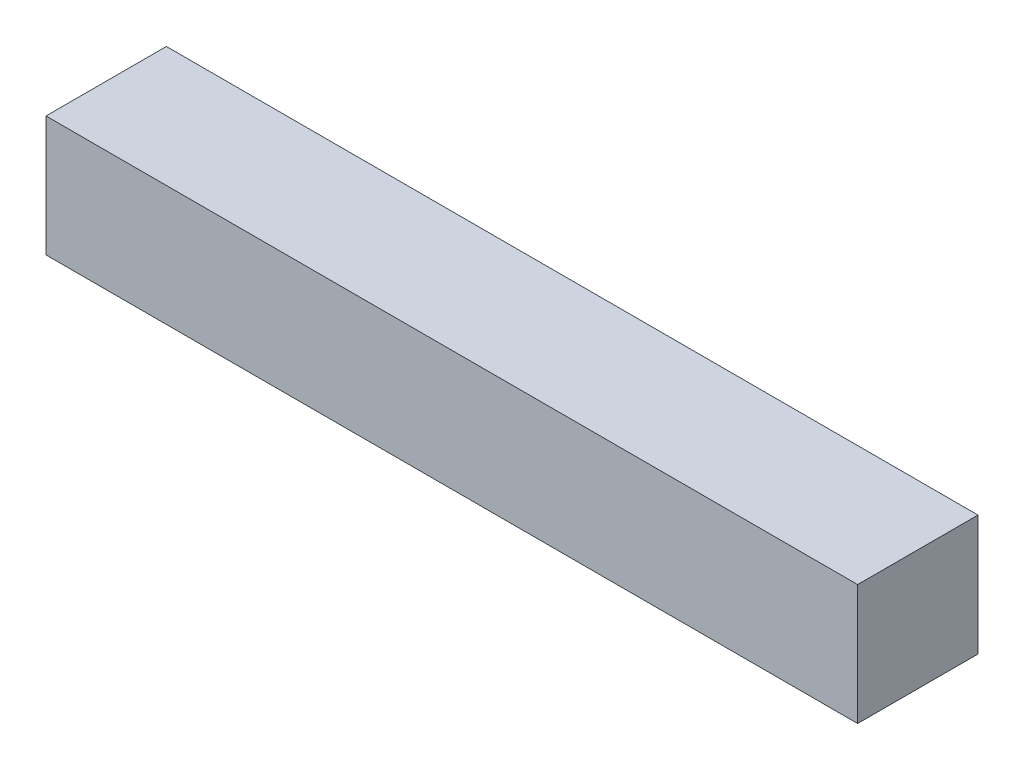
ISO-10303-21;
HEADER;
FILE_DESCRIPTION(('STEP AP214'),'2;1');
FILE_NAME('part.step','',(''),(''),'','','');
FILE_SCHEMA(('AUTOMOTIVE_DESIGN { 1 0 10303 214 1 1 1 1 }'));
ENDSEC;
DATA;
#1=APPLICATION_CONTEXT('core data for automotive mechanical design processes');
#2=APPLICATION_PROTOCOL_DEFINITION('international standard','automotive_design',2000,#1);
#3=PRODUCT_CONTEXT('',#1,'mechanical');
#4=PRODUCT('Part','Part','',(#3));
#5=PRODUCT_RELATED_PRODUCT_CATEGORY('part','',(#4));
#6=PRODUCT_DEFINITION_FORMATION('','',#4);
#7=PRODUCT_DEFINITION_CONTEXT('part definition',#1,'design');
#8=PRODUCT_DEFINITION('design','',#6,#7);
#9=PRODUCT_DEFINITION_SHAPE('','',#8);
#10=(LENGTH_UNIT() NAMED_UNIT(*) SI_UNIT(.MILLI.,.METRE.));
#11=(NAMED_UNIT(*) PLANE_ANGLE_UNIT() SI_UNIT($,.RADIAN.));
#12=(NAMED_UNIT(*) SI_UNIT($,.STERADIAN.) SOLID_ANGLE_UNIT());
#13=UNCERTAINTY_MEASURE_WITH_UNIT(LENGTH_MEASURE(1.E-05),#10,'distance_accuracy_value','');
#14=(GEOMETRIC_REPRESENTATION_CONTEXT(3) GLOBAL_UNCERTAINTY_ASSIGNED_CONTEXT((#13)) GLOBAL_UNIT_ASSIGNED_CONTEXT((#10,
#11,#12)) REPRESENTATION_CONTEXT('',''));
#15=CARTESIAN_POINT('',(0.,0.,0.));
#16=DIRECTION('',(0.,0.,1.));
#17=DIRECTION('',(1.,0.,0.));
#18=AXIS2_PLACEMENT_3D('',#15,#16,#17);
#19=CARTESIAN_POINT('',(0.,0.875,0.));
#20=DIRECTION('',(1.,0.,0.));
#21=DIRECTION('',(0.,0.,-1.));
#22=AXIS2_PLACEMENT_3D('',#19,#20,#21);
#23=PLANE('',#22);
#24=DIRECTION('',(0.,0.,1.));
#25=VECTOR('',#24,1.);
#26=CARTESIAN_POINT('',(0.,0.,0.));
#27=LINE('',#26,#25);
#28=CARTESIAN_POINT('',(0.,0.,0.));
#29=VERTEX_POINT('',#28);
#30=CARTESIAN_POINT('',(0.,0.,0.875));
#31=VERTEX_POINT('',#30);
#32=EDGE_CURVE('E107',#29,#31,#27,.T.);
#33=ORIENTED_EDGE('',*,*,#32,.T.);
#34=DIRECTION('',(0.,-1.,0.));
#35=VECTOR('',#34,1.);
#36=CARTESIAN_POINT('',(0.,0.875,0.875));
#37=LINE('',#36,#35);
#38=CARTESIAN_POINT('',(0.,0.875,0.875));
#39=VERTEX_POINT('',#38);
#40=EDGE_CURVE('E11',#39,#31,#37,.T.);
#41=ORIENTED_EDGE('',*,*,#40,.F.);
#42=DIRECTION('',(0.,0.,1.));
#43=VECTOR('',#42,1.);
#44=CARTESIAN_POINT('',(0.,0.875,0.));
#45=LINE('',#44,#43);
#46=CARTESIAN_POINT('',(0.,0.875,0.));
#47=VERTEX_POINT('',#46);
#48=EDGE_CURVE('E91',#47,#39,#45,.T.);
#49=ORIENTED_EDGE('',*,*,#48,.F.);
#50=DIRECTION('',(0.,-1.,0.));
#51=VECTOR('',#50,1.);
#52=CARTESIAN_POINT('',(0.,0.875,0.));
#53=LINE('',#52,#51);
#54=EDGE_CURVE('E103',#47,#29,#53,.T.);
#55=ORIENTED_EDGE('',*,*,#54,.T.);
#56=EDGE_LOOP('',(#33,#41,#49,#55));
#57=FACE_BOUND('',#56,.T.);
#58=ADVANCED_FACE('F39',(#57),#23,.F.);
#59=CARTESIAN_POINT('',(0.,0.875,0.875));
#60=DIRECTION('',(0.,0.,-1.));
#61=DIRECTION('',(-1.,0.,0.));
#62=AXIS2_PLACEMENT_3D('',#59,#60,#61);
#63=PLANE('',#62);
#64=DIRECTION('',(1.,0.,0.));
#65=VECTOR('',#64,1.);
#66=CARTESIAN_POINT('',(0.,0.,0.875));
#67=LINE('',#66,#65);
#68=CARTESIAN_POINT('',(5.9,0.,0.875));
#69=VERTEX_POINT('',#68);
#70=EDGE_CURVE('E96',#31,#69,#67,.T.);
#71=ORIENTED_EDGE('',*,*,#70,.T.);
#72=DIRECTION('',(0.,-1.,0.));
#73=VECTOR('',#72,1.);
#74=CARTESIAN_POINT('',(5.9,0.875,0.875));
#75=LINE('',#74,#73);
#76=CARTESIAN_POINT('',(5.9,0.875,0.875));
#77=VERTEX_POINT('',#76);
#78=EDGE_CURVE('E48',#77,#69,#75,.T.);
#79=ORIENTED_EDGE('',*,*,#78,.F.);
#80=DIRECTION('',(1.,0.,0.));
#81=VECTOR('',#80,1.);
#82=CARTESIAN_POINT('',(0.,0.875,0.875));
#83=LINE('',#82,#81);
#84=EDGE_CURVE('E86',#39,#77,#83,.T.);
#85=ORIENTED_EDGE('',*,*,#84,.F.);
#86=ORIENTED_EDGE('',*,*,#40,.T.);
#87=EDGE_LOOP('',(#71,#79,#85,#86));
#88=FACE_BOUND('',#87,.T.);
#89=ADVANCED_FACE('F95',(#88),#63,.F.);
#90=CARTESIAN_POINT('',(5.9,0.875,0.));
#91=DIRECTION('',(-1.,0.,0.));
#92=DIRECTION('',(0.,0.,1.));
#93=AXIS2_PLACEMENT_3D('',#90,#91,#92);
#94=PLANE('',#93);
#95=DIRECTION('',(0.,0.,-1.));
#96=VECTOR('',#95,1.);
#97=CARTESIAN_POINT('',(5.9,0.,0.));
#98=LINE('',#97,#96);
#99=CARTESIAN_POINT('',(5.9,0.,0.));
#100=VERTEX_POINT('',#99);
#101=EDGE_CURVE('E73',#69,#100,#98,.T.);
#102=ORIENTED_EDGE('',*,*,#101,.T.);
#103=DIRECTION('',(0.,-1.,0.));
#104=VECTOR('',#103,1.);
#105=CARTESIAN_POINT('',(5.9,0.875,0.));
#106=LINE('',#105,#104);
#107=CARTESIAN_POINT('',(5.9,0.875,0.));
#108=VERTEX_POINT('',#107);
#109=EDGE_CURVE('E98',#108,#100,#106,.T.);
#110=ORIENTED_EDGE('',*,*,#109,.F.);
#111=DIRECTION('',(0.,0.,-1.));
#112=VECTOR('',#111,1.);
#113=CARTESIAN_POINT('',(5.9,0.875,0.));
#114=LINE('',#113,#112);
#115=EDGE_CURVE('E89',#77,#108,#114,.T.);
#116=ORIENTED_EDGE('',*,*,#115,.F.);
#117=ORIENTED_EDGE('',*,*,#78,.T.);
#118=EDGE_LOOP('',(#102,#110,#116,#117));
#119=FACE_BOUND('',#118,.T.);
#120=ADVANCED_FACE('F99',(#119),#94,.F.);
#121=CARTESIAN_POINT('',(0.,0.875,0.));
#122=DIRECTION('',(0.,0.,1.));
#123=DIRECTION('',(1.,0.,0.));
#124=AXIS2_PLACEMENT_3D('',#121,#122,#123);
#125=PLANE('',#124);
#126=DIRECTION('',(-1.,0.,0.));
#127=VECTOR('',#126,1.);
#128=CARTESIAN_POINT('',(0.,0.,0.));
#129=LINE('',#128,#127);
#130=EDGE_CURVE('E79',#100,#29,#129,.T.);
#131=ORIENTED_EDGE('',*,*,#130,.T.);
#132=ORIENTED_EDGE('',*,*,#54,.F.);
#133=DIRECTION('',(-1.,0.,0.));
#134=VECTOR('',#133,1.);
#135=CARTESIAN_POINT('',(0.,0.875,0.));
#136=LINE('',#135,#134);
#137=EDGE_CURVE('E56',#108,#47,#136,.T.);
#138=ORIENTED_EDGE('',*,*,#137,.F.);
#139=ORIENTED_EDGE('',*,*,#109,.T.);
#140=EDGE_LOOP('',(#131,#132,#138,#139));
#141=FACE_BOUND('',#140,.T.);
#142=ADVANCED_FACE('F120',(#141),#125,.F.);
#143=CARTESIAN_POINT('',(0.,0.875,0.));
#144=DIRECTION('',(0.,1.,0.));
#145=DIRECTION('',(0.,0.,1.));
#146=AXIS2_PLACEMENT_3D('',#143,#144,#145);
#147=PLANE('',#146);
#148=ORIENTED_EDGE('',*,*,#48,.T.);
#149=ORIENTED_EDGE('',*,*,#84,.T.);
#150=ORIENTED_EDGE('',*,*,#115,.T.);
#151=ORIENTED_EDGE('',*,*,#137,.T.);
#152=EDGE_LOOP('',(#148,#149,#150,#151));
#153=FACE_BOUND('',#152,.T.);
#154=ADVANCED_FACE('F87',(#153),#147,.T.);
#155=CARTESIAN_POINT('',(0.,0.,0.));
#156=DIRECTION('',(0.,1.,0.));
#157=DIRECTION('',(0.,0.,1.));
#158=AXIS2_PLACEMENT_3D('',#155,#156,#157);
#159=PLANE('',#158);
#160=ORIENTED_EDGE('',*,*,#32,.F.);
#161=ORIENTED_EDGE('',*,*,#130,.F.);
#162=ORIENTED_EDGE('',*,*,#101,.F.);
#163=ORIENTED_EDGE('',*,*,#70,.F.);
#164=EDGE_LOOP('',(#160,#161,#162,#163));
#165=FACE_BOUND('',#164,.T.);
#166=ADVANCED_FACE('F123',(#165),#159,.F.);
#167=CLOSED_SHELL('',(#58,#89,#120,#142,#154,#166));
#168=MANIFOLD_SOLID_BREP('B2',#167);
#169=ADVANCED_BREP_SHAPE_REPRESENTATION('',(#18,#168),#14);
#170=SHAPE_DEFINITION_REPRESENTATION(#9,#169);
ENDSEC;
END-ISO-10303-21;
